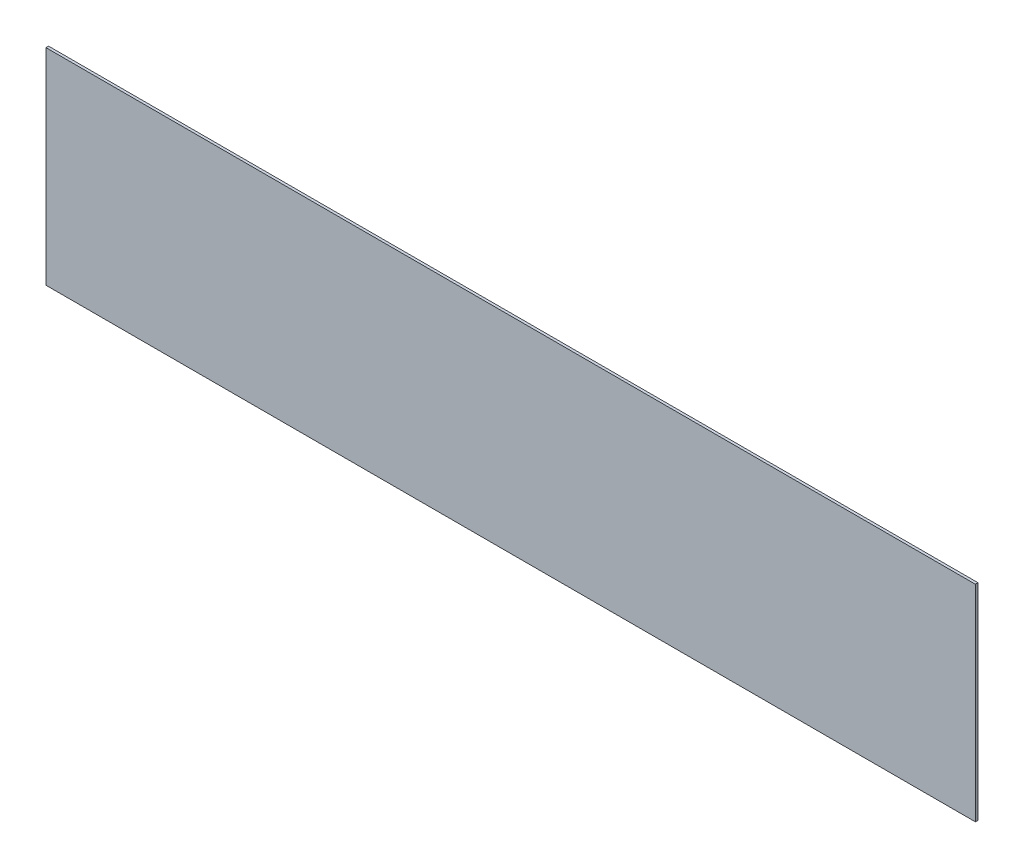
ISO-10303-21;
HEADER;
FILE_DESCRIPTION(('STEP AP214'),'2;1');
FILE_NAME('part.step','',(''),(''),'','','');
FILE_SCHEMA(('AUTOMOTIVE_DESIGN { 1 0 10303 214 1 1 1 1 }'));
ENDSEC;
DATA;
#1=APPLICATION_CONTEXT('core data for automotive mechanical design processes');
#2=APPLICATION_PROTOCOL_DEFINITION('international standard','automotive_design',2000,#1);
#3=PRODUCT_CONTEXT('',#1,'mechanical');
#4=PRODUCT('Part','Part','',(#3));
#5=PRODUCT_RELATED_PRODUCT_CATEGORY('part','',(#4));
#6=PRODUCT_DEFINITION_FORMATION('','',#4);
#7=PRODUCT_DEFINITION_CONTEXT('part definition',#1,'design');
#8=PRODUCT_DEFINITION('design','',#6,#7);
#9=PRODUCT_DEFINITION_SHAPE('','',#8);
#10=(LENGTH_UNIT() NAMED_UNIT(*) SI_UNIT(.MILLI.,.METRE.));
#11=(NAMED_UNIT(*) PLANE_ANGLE_UNIT() SI_UNIT($,.RADIAN.));
#12=(NAMED_UNIT(*) SI_UNIT($,.STERADIAN.) SOLID_ANGLE_UNIT());
#13=UNCERTAINTY_MEASURE_WITH_UNIT(LENGTH_MEASURE(1.E-05),#10,'distance_accuracy_value','');
#14=(GEOMETRIC_REPRESENTATION_CONTEXT(3) GLOBAL_UNCERTAINTY_ASSIGNED_CONTEXT((#13)) GLOBAL_UNIT_ASSIGNED_CONTEXT((#10,
#11,#12)) REPRESENTATION_CONTEXT('',''));
#15=CARTESIAN_POINT('',(0.,0.,0.));
#16=DIRECTION('',(0.,0.,1.));
#17=DIRECTION('',(1.,0.,0.));
#18=AXIS2_PLACEMENT_3D('',#15,#16,#17);
#19=CARTESIAN_POINT('',(-1.778,-0.3937,0.00999998));
#20=DIRECTION('',(0.,0.,1.));
#21=DIRECTION('',(1.,0.,0.));
#22=AXIS2_PLACEMENT_3D('',#19,#20,#21);
#23=PLANE('',#22);
#24=DIRECTION('',(1.,0.,0.));
#25=VECTOR('',#24,1.);
#26=CARTESIAN_POINT('',(-1.778,0.3937,0.00999998));
#27=LINE('',#26,#25);
#28=CARTESIAN_POINT('',(-1.778,0.3937,0.00999998));
#29=VERTEX_POINT('',#28);
#30=CARTESIAN_POINT('',(1.778,0.3937,0.00999998));
#31=VERTEX_POINT('',#30);
#32=EDGE_CURVE('E53',#29,#31,#27,.T.);
#33=ORIENTED_EDGE('',*,*,#32,.F.);
#34=DIRECTION('',(0.,1.,0.));
#35=VECTOR('',#34,1.);
#36=CARTESIAN_POINT('',(-1.778,-0.3937,0.00999998));
#37=LINE('',#36,#35);
#38=CARTESIAN_POINT('',(-1.778,-0.3937,0.00999998));
#39=VERTEX_POINT('',#38);
#40=EDGE_CURVE('E20',#29,#39,#37,.F.);
#41=ORIENTED_EDGE('',*,*,#40,.T.);
#42=DIRECTION('',(1.,0.,0.));
#43=VECTOR('',#42,1.);
#44=CARTESIAN_POINT('',(1.778,-0.3937,0.00999998));
#45=LINE('',#44,#43);
#46=CARTESIAN_POINT('',(1.778,-0.3937,0.00999998));
#47=VERTEX_POINT('',#46);
#48=EDGE_CURVE('E67',#47,#39,#45,.F.);
#49=ORIENTED_EDGE('',*,*,#48,.F.);
#50=DIRECTION('',(0.,1.,0.));
#51=VECTOR('',#50,1.);
#52=CARTESIAN_POINT('',(1.778,0.3937,0.00999998));
#53=LINE('',#52,#51);
#54=EDGE_CURVE('E58',#31,#47,#53,.F.);
#55=ORIENTED_EDGE('',*,*,#54,.F.);
#56=EDGE_LOOP('',(#33,#41,#49,#55));
#57=FACE_BOUND('',#56,.T.);
#58=ADVANCED_FACE('F17',(#57),#23,.T.);
#59=CARTESIAN_POINT('',(1.778,-0.3937,0.));
#60=DIRECTION('',(0.,-1.,0.));
#61=DIRECTION('',(0.,0.,-1.));
#62=AXIS2_PLACEMENT_3D('',#59,#60,#61);
#63=PLANE('',#62);
#64=DIRECTION('',(0.,0.,1.));
#65=VECTOR('',#64,1.);
#66=CARTESIAN_POINT('',(-1.778,-0.3937,0.));
#67=LINE('',#66,#65);
#68=CARTESIAN_POINT('',(-1.778,-0.3937,0.));
#69=VERTEX_POINT('',#68);
#70=EDGE_CURVE('E80',#69,#39,#67,.T.);
#71=ORIENTED_EDGE('',*,*,#70,.F.);
#72=DIRECTION('',(1.,0.,0.));
#73=VECTOR('',#72,1.);
#74=CARTESIAN_POINT('',(-1.778,-0.3937,0.));
#75=LINE('',#74,#73);
#76=CARTESIAN_POINT('',(1.778,-0.3937,0.));
#77=VERTEX_POINT('',#76);
#78=EDGE_CURVE('E75',#69,#77,#75,.T.);
#79=ORIENTED_EDGE('',*,*,#78,.T.);
#80=DIRECTION('',(0.,0.,-1.));
#81=VECTOR('',#80,1.);
#82=CARTESIAN_POINT('',(1.778,-0.3937,0.));
#83=LINE('',#82,#81);
#84=EDGE_CURVE('E63',#47,#77,#83,.T.);
#85=ORIENTED_EDGE('',*,*,#84,.F.);
#86=ORIENTED_EDGE('',*,*,#48,.T.);
#87=EDGE_LOOP('',(#71,#79,#85,#86));
#88=FACE_BOUND('',#87,.T.);
#89=ADVANCED_FACE('F74',(#88),#63,.T.);
#90=CARTESIAN_POINT('',(1.778,0.3937,0.));
#91=DIRECTION('',(1.,0.,0.));
#92=DIRECTION('',(0.,0.,-1.));
#93=AXIS2_PLACEMENT_3D('',#90,#91,#92);
#94=PLANE('',#93);
#95=ORIENTED_EDGE('',*,*,#84,.T.);
#96=DIRECTION('',(0.,1.,0.));
#97=VECTOR('',#96,1.);
#98=CARTESIAN_POINT('',(1.778,-0.3937,0.));
#99=LINE('',#98,#97);
#100=CARTESIAN_POINT('',(1.778,0.3937,0.));
#101=VERTEX_POINT('',#100);
#102=EDGE_CURVE('E84',#77,#101,#99,.T.);
#103=ORIENTED_EDGE('',*,*,#102,.T.);
#104=DIRECTION('',(0.,0.,1.));
#105=VECTOR('',#104,1.);
#106=CARTESIAN_POINT('',(1.778,0.3937,0.));
#107=LINE('',#106,#105);
#108=EDGE_CURVE('E65',#31,#101,#107,.F.);
#109=ORIENTED_EDGE('',*,*,#108,.F.);
#110=ORIENTED_EDGE('',*,*,#54,.T.);
#111=EDGE_LOOP('',(#95,#103,#109,#110));
#112=FACE_BOUND('',#111,.T.);
#113=ADVANCED_FACE('F60',(#112),#94,.T.);
#114=CARTESIAN_POINT('',(-1.778,0.3937,0.));
#115=DIRECTION('',(0.,1.,0.));
#116=DIRECTION('',(0.,0.,1.));
#117=AXIS2_PLACEMENT_3D('',#114,#115,#116);
#118=PLANE('',#117);
#119=ORIENTED_EDGE('',*,*,#108,.T.);
#120=DIRECTION('',(1.,0.,0.));
#121=VECTOR('',#120,1.);
#122=CARTESIAN_POINT('',(-1.778,0.3937,0.));
#123=LINE('',#122,#121);
#124=CARTESIAN_POINT('',(-1.778,0.3937,0.));
#125=VERTEX_POINT('',#124);
#126=EDGE_CURVE('E26',#101,#125,#123,.F.);
#127=ORIENTED_EDGE('',*,*,#126,.T.);
#128=DIRECTION('',(0.,0.,1.));
#129=VECTOR('',#128,1.);
#130=CARTESIAN_POINT('',(-1.778,0.3937,0.));
#131=LINE('',#130,#129);
#132=EDGE_CURVE('E34',#29,#125,#131,.F.);
#133=ORIENTED_EDGE('',*,*,#132,.F.);
#134=ORIENTED_EDGE('',*,*,#32,.T.);
#135=EDGE_LOOP('',(#119,#127,#133,#134));
#136=FACE_BOUND('',#135,.T.);
#137=ADVANCED_FACE('F88',(#136),#118,.T.);
#138=CARTESIAN_POINT('',(-1.778,-0.3937,0.));
#139=DIRECTION('',(-1.,0.,0.));
#140=DIRECTION('',(0.,0.,1.));
#141=AXIS2_PLACEMENT_3D('',#138,#139,#140);
#142=PLANE('',#141);
#143=ORIENTED_EDGE('',*,*,#132,.T.);
#144=DIRECTION('',(0.,1.,0.));
#145=VECTOR('',#144,1.);
#146=CARTESIAN_POINT('',(-1.778,-0.3937,0.));
#147=LINE('',#146,#145);
#148=EDGE_CURVE('E11',#125,#69,#147,.F.);
#149=ORIENTED_EDGE('',*,*,#148,.T.);
#150=ORIENTED_EDGE('',*,*,#70,.T.);
#151=ORIENTED_EDGE('',*,*,#40,.F.);
#152=EDGE_LOOP('',(#143,#149,#150,#151));
#153=FACE_BOUND('',#152,.T.);
#154=ADVANCED_FACE('F91',(#153),#142,.T.);
#155=CARTESIAN_POINT('',(-1.778,-0.3937,0.));
#156=DIRECTION('',(0.,0.,1.));
#157=DIRECTION('',(1.,0.,0.));
#158=AXIS2_PLACEMENT_3D('',#155,#156,#157);
#159=PLANE('',#158);
#160=ORIENTED_EDGE('',*,*,#126,.F.);
#161=ORIENTED_EDGE('',*,*,#102,.F.);
#162=ORIENTED_EDGE('',*,*,#78,.F.);
#163=ORIENTED_EDGE('',*,*,#148,.F.);
#164=EDGE_LOOP('',(#160,#161,#162,#163));
#165=FACE_BOUND('',#164,.T.);
#166=ADVANCED_FACE('F90',(#165),#159,.F.);
#167=CLOSED_SHELL('',(#58,#89,#113,#137,#154,#166));
#168=MANIFOLD_SOLID_BREP('B1',#167);
#169=ADVANCED_BREP_SHAPE_REPRESENTATION('',(#18,#168),#14);
#170=SHAPE_DEFINITION_REPRESENTATION(#9,#169);
ENDSEC;
END-ISO-10303-21;
